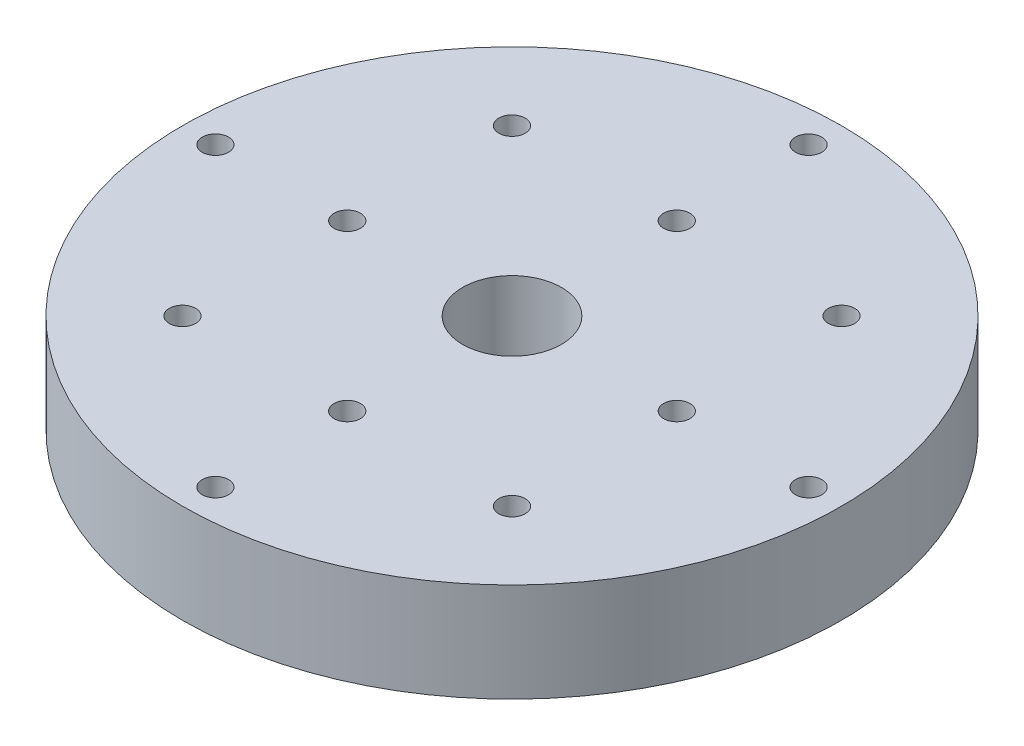
ISO-10303-21;
HEADER;
FILE_DESCRIPTION(('STEP AP214'),'2;1');
FILE_NAME('part.step','',(''),(''),'','','');
FILE_SCHEMA(('AUTOMOTIVE_DESIGN { 1 0 10303 214 1 1 1 1 }'));
ENDSEC;
DATA;
#1=APPLICATION_CONTEXT('core data for automotive mechanical design processes');
#2=APPLICATION_PROTOCOL_DEFINITION('international standard','automotive_design',2000,#1);
#3=PRODUCT_CONTEXT('',#1,'mechanical');
#4=PRODUCT('Part','Part','',(#3));
#5=PRODUCT_RELATED_PRODUCT_CATEGORY('part','',(#4));
#6=PRODUCT_DEFINITION_FORMATION('','',#4);
#7=PRODUCT_DEFINITION_CONTEXT('part definition',#1,'design');
#8=PRODUCT_DEFINITION('design','',#6,#7);
#9=PRODUCT_DEFINITION_SHAPE('','',#8);
#10=(LENGTH_UNIT() NAMED_UNIT(*) SI_UNIT(.MILLI.,.METRE.));
#11=(NAMED_UNIT(*) PLANE_ANGLE_UNIT() SI_UNIT($,.RADIAN.));
#12=(NAMED_UNIT(*) SI_UNIT($,.STERADIAN.) SOLID_ANGLE_UNIT());
#13=UNCERTAINTY_MEASURE_WITH_UNIT(LENGTH_MEASURE(1.E-05),#10,'distance_accuracy_value','');
#14=(GEOMETRIC_REPRESENTATION_CONTEXT(3) GLOBAL_UNCERTAINTY_ASSIGNED_CONTEXT((#13)) GLOBAL_UNIT_ASSIGNED_CONTEXT((#10,
#11,#12)) REPRESENTATION_CONTEXT('',''));
#15=CARTESIAN_POINT('',(0.,0.,0.));
#16=DIRECTION('',(0.,0.,1.));
#17=DIRECTION('',(1.,0.,0.));
#18=AXIS2_PLACEMENT_3D('',#15,#16,#17);
#19=CARTESIAN_POINT('',(0.,15.,0.));
#20=DIRECTION('',(0.,-1.,0.));
#21=DIRECTION('',(0.,0.,-1.));
#22=AXIS2_PLACEMENT_3D('',#19,#20,#21);
#23=CYLINDRICAL_SURFACE('',#22,50.);
#24=CARTESIAN_POINT('',(0.,15.,0.));
#25=DIRECTION('',(0.,1.,0.));
#26=DIRECTION('',(0.,0.,1.));
#27=AXIS2_PLACEMENT_3D('',#24,#25,#26);
#28=CIRCLE('',#27,50.);
#29=CARTESIAN_POINT('',(0.,15.,50.));
#30=VERTEX_POINT('',#29);
#31=EDGE_CURVE('E10',#30,#30,#28,.T.);
#32=ORIENTED_EDGE('',*,*,#31,.F.);
#33=EDGE_LOOP('',(#32));
#34=FACE_BOUND('',#33,.T.);
#35=CARTESIAN_POINT('',(0.,0.,0.));
#36=DIRECTION('',(0.,1.,0.));
#37=DIRECTION('',(0.,0.,1.));
#38=AXIS2_PLACEMENT_3D('',#35,#36,#37);
#39=CIRCLE('',#38,50.);
#40=CARTESIAN_POINT('',(0.,0.,50.));
#41=VERTEX_POINT('',#40);
#42=EDGE_CURVE('E50',#41,#41,#39,.T.);
#43=ORIENTED_EDGE('',*,*,#42,.T.);
#44=EDGE_LOOP('',(#43));
#45=FACE_BOUND('',#44,.T.);
#46=ADVANCED_FACE('F47',(#34,#45),#23,.T.);
#47=CARTESIAN_POINT('',(0.,15.,0.));
#48=DIRECTION('',(0.,1.,0.));
#49=DIRECTION('',(0.,0.,1.));
#50=AXIS2_PLACEMENT_3D('',#47,#48,#49);
#51=PLANE('',#50);
#52=CARTESIAN_POINT('',(25.,15.,25.));
#53=DIRECTION('',(0.,1.,0.));
#54=DIRECTION('',(0.,0.,1.));
#55=AXIS2_PLACEMENT_3D('',#52,#53,#54);
#56=CIRCLE('',#55,2.);
#57=CARTESIAN_POINT('',(25.,15.,27.));
#58=VERTEX_POINT('',#57);
#59=EDGE_CURVE('E122',#58,#58,#56,.T.);
#60=ORIENTED_EDGE('',*,*,#59,.F.);
#61=EDGE_LOOP('',(#60));
#62=FACE_BOUND('',#61,.T.);
#63=CARTESIAN_POINT('',(0.,15.,25.));
#64=DIRECTION('',(0.,1.,0.));
#65=DIRECTION('',(0.,0.,1.));
#66=AXIS2_PLACEMENT_3D('',#63,#64,#65);
#67=CIRCLE('',#66,2.);
#68=CARTESIAN_POINT('',(0.,15.,27.));
#69=VERTEX_POINT('',#68);
#70=EDGE_CURVE('E108',#69,#69,#67,.T.);
#71=ORIENTED_EDGE('',*,*,#70,.F.);
#72=EDGE_LOOP('',(#71));
#73=FACE_BOUND('',#72,.T.);
#74=CARTESIAN_POINT('',(0.,15.,45.));
#75=DIRECTION('',(0.,1.,0.));
#76=DIRECTION('',(0.,0.,1.));
#77=AXIS2_PLACEMENT_3D('',#74,#75,#76);
#78=CIRCLE('',#77,2.);
#79=CARTESIAN_POINT('',(0.,15.,47.));
#80=VERTEX_POINT('',#79);
#81=EDGE_CURVE('E107',#80,#80,#78,.T.);
#82=ORIENTED_EDGE('',*,*,#81,.F.);
#83=EDGE_LOOP('',(#82));
#84=FACE_BOUND('',#83,.T.);
#85=CARTESIAN_POINT('',(45.,15.,0.));
#86=DIRECTION('',(0.,1.,0.));
#87=DIRECTION('',(0.,0.,1.));
#88=AXIS2_PLACEMENT_3D('',#85,#86,#87);
#89=CIRCLE('',#88,2.);
#90=CARTESIAN_POINT('',(45.,15.,1.99999999999999));
#91=VERTEX_POINT('',#90);
#92=EDGE_CURVE('E65',#91,#91,#89,.T.);
#93=ORIENTED_EDGE('',*,*,#92,.F.);
#94=EDGE_LOOP('',(#93));
#95=FACE_BOUND('',#94,.T.);
#96=CARTESIAN_POINT('',(-25.,15.,-25.));
#97=DIRECTION('',(0.,1.,0.));
#98=DIRECTION('',(0.,0.,1.));
#99=AXIS2_PLACEMENT_3D('',#96,#97,#98);
#100=CIRCLE('',#99,2.);
#101=CARTESIAN_POINT('',(-25.,15.,-23.));
#102=VERTEX_POINT('',#101);
#103=EDGE_CURVE('E91',#102,#102,#100,.T.);
#104=ORIENTED_EDGE('',*,*,#103,.F.);
#105=EDGE_LOOP('',(#104));
#106=FACE_BOUND('',#105,.T.);
#107=CARTESIAN_POINT('',(-45.,15.,0.));
#108=DIRECTION('',(0.,1.,0.));
#109=DIRECTION('',(0.,0.,1.));
#110=AXIS2_PLACEMENT_3D('',#107,#108,#109);
#111=CIRCLE('',#110,2.);
#112=CARTESIAN_POINT('',(-45.,15.,2.));
#113=VERTEX_POINT('',#112);
#114=EDGE_CURVE('E74',#113,#113,#111,.T.);
#115=ORIENTED_EDGE('',*,*,#114,.F.);
#116=EDGE_LOOP('',(#115));
#117=FACE_BOUND('',#116,.T.);
#118=CARTESIAN_POINT('',(-25.,15.,0.));
#119=DIRECTION('',(0.,1.,0.));
#120=DIRECTION('',(0.,0.,1.));
#121=AXIS2_PLACEMENT_3D('',#118,#119,#120);
#122=CIRCLE('',#121,2.);
#123=CARTESIAN_POINT('',(-25.,15.,2.));
#124=VERTEX_POINT('',#123);
#125=EDGE_CURVE('E73',#124,#124,#122,.T.);
#126=ORIENTED_EDGE('',*,*,#125,.F.);
#127=EDGE_LOOP('',(#126));
#128=FACE_BOUND('',#127,.T.);
#129=CARTESIAN_POINT('',(-25.,15.,25.));
#130=DIRECTION('',(0.,1.,0.));
#131=DIRECTION('',(0.,0.,1.));
#132=AXIS2_PLACEMENT_3D('',#129,#130,#131);
#133=CIRCLE('',#132,2.);
#134=CARTESIAN_POINT('',(-25.,15.,27.));
#135=VERTEX_POINT('',#134);
#136=EDGE_CURVE('E82',#135,#135,#133,.T.);
#137=ORIENTED_EDGE('',*,*,#136,.F.);
#138=EDGE_LOOP('',(#137));
#139=FACE_BOUND('',#138,.T.);
#140=CARTESIAN_POINT('',(0.,15.,-45.));
#141=DIRECTION('',(0.,1.,0.));
#142=DIRECTION('',(0.,0.,1.));
#143=AXIS2_PLACEMENT_3D('',#140,#141,#142);
#144=CIRCLE('',#143,2.);
#145=CARTESIAN_POINT('',(0.,15.,-43.));
#146=VERTEX_POINT('',#145);
#147=EDGE_CURVE('E92',#146,#146,#144,.T.);
#148=ORIENTED_EDGE('',*,*,#147,.F.);
#149=EDGE_LOOP('',(#148));
#150=FACE_BOUND('',#149,.T.);
#151=CARTESIAN_POINT('',(0.,15.,-25.));
#152=DIRECTION('',(0.,1.,0.));
#153=DIRECTION('',(0.,0.,1.));
#154=AXIS2_PLACEMENT_3D('',#151,#152,#153);
#155=CIRCLE('',#154,2.);
#156=CARTESIAN_POINT('',(0.,15.,-23.));
#157=VERTEX_POINT('',#156);
#158=EDGE_CURVE('E153',#157,#157,#155,.T.);
#159=ORIENTED_EDGE('',*,*,#158,.F.);
#160=EDGE_LOOP('',(#159));
#161=FACE_BOUND('',#160,.T.);
#162=CARTESIAN_POINT('',(25.,15.,-25.));
#163=DIRECTION('',(0.,1.,0.));
#164=DIRECTION('',(0.,0.,1.));
#165=AXIS2_PLACEMENT_3D('',#162,#163,#164);
#166=CIRCLE('',#165,2.);
#167=CARTESIAN_POINT('',(25.,15.,-23.));
#168=VERTEX_POINT('',#167);
#169=EDGE_CURVE('E145',#168,#168,#166,.T.);
#170=ORIENTED_EDGE('',*,*,#169,.F.);
#171=EDGE_LOOP('',(#170));
#172=FACE_BOUND('',#171,.T.);
#173=CARTESIAN_POINT('',(25.,15.,0.));
#174=DIRECTION('',(0.,1.,0.));
#175=DIRECTION('',(0.,0.,1.));
#176=AXIS2_PLACEMENT_3D('',#173,#174,#175);
#177=CIRCLE('',#176,2.);
#178=CARTESIAN_POINT('',(25.,15.,2.));
#179=VERTEX_POINT('',#178);
#180=EDGE_CURVE('E137',#179,#179,#177,.T.);
#181=ORIENTED_EDGE('',*,*,#180,.F.);
#182=EDGE_LOOP('',(#181));
#183=FACE_BOUND('',#182,.T.);
#184=CARTESIAN_POINT('',(0.,15.,0.));
#185=DIRECTION('',(0.,1.,0.));
#186=DIRECTION('',(0.,0.,1.));
#187=AXIS2_PLACEMENT_3D('',#184,#185,#186);
#188=CIRCLE('',#187,7.5);
#189=CARTESIAN_POINT('',(0.,15.,7.5));
#190=VERTEX_POINT('',#189);
#191=EDGE_CURVE('E61',#190,#190,#188,.T.);
#192=ORIENTED_EDGE('',*,*,#191,.F.);
#193=EDGE_LOOP('',(#192));
#194=FACE_BOUND('',#193,.T.);
#195=ORIENTED_EDGE('',*,*,#31,.T.);
#196=EDGE_LOOP('',(#195));
#197=FACE_BOUND('',#196,.T.);
#198=ADVANCED_FACE('F167',(#62,#73,#84,#95,#106,#117,#128,#139,#150,#161,#172,#183,#194,#197),
#51,.T.);
#199=CARTESIAN_POINT('',(0.,0.,0.));
#200=DIRECTION('',(0.,1.,0.));
#201=DIRECTION('',(0.,0.,1.));
#202=AXIS2_PLACEMENT_3D('',#199,#200,#201);
#203=PLANE('',#202);
#204=CARTESIAN_POINT('',(25.,0.,25.));
#205=DIRECTION('',(0.,1.,0.));
#206=DIRECTION('',(0.,0.,1.));
#207=AXIS2_PLACEMENT_3D('',#204,#205,#206);
#208=CIRCLE('',#207,2.);
#209=CARTESIAN_POINT('',(25.,0.,27.));
#210=VERTEX_POINT('',#209);
#211=EDGE_CURVE('E86',#210,#210,#208,.T.);
#212=ORIENTED_EDGE('',*,*,#211,.T.);
#213=EDGE_LOOP('',(#212));
#214=FACE_BOUND('',#213,.T.);
#215=CARTESIAN_POINT('',(0.,0.,25.));
#216=DIRECTION('',(0.,1.,0.));
#217=DIRECTION('',(0.,0.,1.));
#218=AXIS2_PLACEMENT_3D('',#215,#216,#217);
#219=CIRCLE('',#218,2.);
#220=CARTESIAN_POINT('',(0.,0.,27.));
#221=VERTEX_POINT('',#220);
#222=EDGE_CURVE('E126',#221,#221,#219,.T.);
#223=ORIENTED_EDGE('',*,*,#222,.T.);
#224=EDGE_LOOP('',(#223));
#225=FACE_BOUND('',#224,.T.);
#226=CARTESIAN_POINT('',(0.,0.,45.));
#227=DIRECTION('',(0.,1.,0.));
#228=DIRECTION('',(0.,0.,1.));
#229=AXIS2_PLACEMENT_3D('',#226,#227,#228);
#230=CIRCLE('',#229,2.);
#231=CARTESIAN_POINT('',(0.,0.,47.));
#232=VERTEX_POINT('',#231);
#233=EDGE_CURVE('E103',#232,#232,#230,.T.);
#234=ORIENTED_EDGE('',*,*,#233,.T.);
#235=EDGE_LOOP('',(#234));
#236=FACE_BOUND('',#235,.T.);
#237=CARTESIAN_POINT('',(45.,0.,0.));
#238=DIRECTION('',(0.,1.,0.));
#239=DIRECTION('',(0.,0.,1.));
#240=AXIS2_PLACEMENT_3D('',#237,#238,#239);
#241=CIRCLE('',#240,2.);
#242=CARTESIAN_POINT('',(45.,0.,1.99999999999999));
#243=VERTEX_POINT('',#242);
#244=EDGE_CURVE('E112',#243,#243,#241,.T.);
#245=ORIENTED_EDGE('',*,*,#244,.T.);
#246=EDGE_LOOP('',(#245));
#247=FACE_BOUND('',#246,.T.);
#248=CARTESIAN_POINT('',(-25.,0.,-25.));
#249=DIRECTION('',(0.,1.,0.));
#250=DIRECTION('',(0.,0.,1.));
#251=AXIS2_PLACEMENT_3D('',#248,#249,#250);
#252=CIRCLE('',#251,2.);
#253=CARTESIAN_POINT('',(-25.,0.,-23.));
#254=VERTEX_POINT('',#253);
#255=EDGE_CURVE('E87',#254,#254,#252,.T.);
#256=ORIENTED_EDGE('',*,*,#255,.T.);
#257=EDGE_LOOP('',(#256));
#258=FACE_BOUND('',#257,.T.);
#259=CARTESIAN_POINT('',(-45.,0.,0.));
#260=DIRECTION('',(0.,1.,0.));
#261=DIRECTION('',(0.,0.,1.));
#262=AXIS2_PLACEMENT_3D('',#259,#260,#261);
#263=CIRCLE('',#262,2.);
#264=CARTESIAN_POINT('',(-45.,0.,2.));
#265=VERTEX_POINT('',#264);
#266=EDGE_CURVE('E96',#265,#265,#263,.T.);
#267=ORIENTED_EDGE('',*,*,#266,.T.);
#268=EDGE_LOOP('',(#267));
#269=FACE_BOUND('',#268,.T.);
#270=CARTESIAN_POINT('',(-25.,0.,0.));
#271=DIRECTION('',(0.,1.,0.));
#272=DIRECTION('',(0.,0.,1.));
#273=AXIS2_PLACEMENT_3D('',#270,#271,#272);
#274=CIRCLE('',#273,2.);
#275=CARTESIAN_POINT('',(-25.,0.,2.));
#276=VERTEX_POINT('',#275);
#277=EDGE_CURVE('E69',#276,#276,#274,.T.);
#278=ORIENTED_EDGE('',*,*,#277,.T.);
#279=EDGE_LOOP('',(#278));
#280=FACE_BOUND('',#279,.T.);
#281=CARTESIAN_POINT('',(-25.,0.,25.));
#282=DIRECTION('',(0.,1.,0.));
#283=DIRECTION('',(0.,0.,1.));
#284=AXIS2_PLACEMENT_3D('',#281,#282,#283);
#285=CIRCLE('',#284,2.);
#286=CARTESIAN_POINT('',(-25.,0.,27.));
#287=VERTEX_POINT('',#286);
#288=EDGE_CURVE('E78',#287,#287,#285,.T.);
#289=ORIENTED_EDGE('',*,*,#288,.T.);
#290=EDGE_LOOP('',(#289));
#291=FACE_BOUND('',#290,.T.);
#292=CARTESIAN_POINT('',(0.,0.,-45.));
#293=DIRECTION('',(0.,1.,0.));
#294=DIRECTION('',(0.,0.,1.));
#295=AXIS2_PLACEMENT_3D('',#292,#293,#294);
#296=CIRCLE('',#295,2.);
#297=CARTESIAN_POINT('',(0.,0.,-43.));
#298=VERTEX_POINT('',#297);
#299=EDGE_CURVE('E157',#298,#298,#296,.T.);
#300=ORIENTED_EDGE('',*,*,#299,.T.);
#301=EDGE_LOOP('',(#300));
#302=FACE_BOUND('',#301,.T.);
#303=CARTESIAN_POINT('',(0.,0.,-25.));
#304=DIRECTION('',(0.,1.,0.));
#305=DIRECTION('',(0.,0.,1.));
#306=AXIS2_PLACEMENT_3D('',#303,#304,#305);
#307=CIRCLE('',#306,2.);
#308=CARTESIAN_POINT('',(0.,0.,-23.));
#309=VERTEX_POINT('',#308);
#310=EDGE_CURVE('E149',#309,#309,#307,.T.);
#311=ORIENTED_EDGE('',*,*,#310,.T.);
#312=EDGE_LOOP('',(#311));
#313=FACE_BOUND('',#312,.T.);
#314=CARTESIAN_POINT('',(25.,0.,-25.));
#315=DIRECTION('',(0.,1.,0.));
#316=DIRECTION('',(0.,0.,1.));
#317=AXIS2_PLACEMENT_3D('',#314,#315,#316);
#318=CIRCLE('',#317,2.);
#319=CARTESIAN_POINT('',(25.,0.,-23.));
#320=VERTEX_POINT('',#319);
#321=EDGE_CURVE('E141',#320,#320,#318,.T.);
#322=ORIENTED_EDGE('',*,*,#321,.T.);
#323=EDGE_LOOP('',(#322));
#324=FACE_BOUND('',#323,.T.);
#325=CARTESIAN_POINT('',(25.,0.,0.));
#326=DIRECTION('',(0.,1.,0.));
#327=DIRECTION('',(0.,0.,1.));
#328=AXIS2_PLACEMENT_3D('',#325,#326,#327);
#329=CIRCLE('',#328,2.);
#330=CARTESIAN_POINT('',(25.,0.,2.));
#331=VERTEX_POINT('',#330);
#332=EDGE_CURVE('E133',#331,#331,#329,.T.);
#333=ORIENTED_EDGE('',*,*,#332,.T.);
#334=EDGE_LOOP('',(#333));
#335=FACE_BOUND('',#334,.T.);
#336=CARTESIAN_POINT('',(0.,0.,0.));
#337=DIRECTION('',(0.,1.,0.));
#338=DIRECTION('',(0.,0.,1.));
#339=AXIS2_PLACEMENT_3D('',#336,#337,#338);
#340=CIRCLE('',#339,7.5);
#341=CARTESIAN_POINT('',(0.,0.,7.5));
#342=VERTEX_POINT('',#341);
#343=EDGE_CURVE('E59',#342,#342,#340,.T.);
#344=ORIENTED_EDGE('',*,*,#343,.T.);
#345=EDGE_LOOP('',(#344));
#346=FACE_BOUND('',#345,.T.);
#347=ORIENTED_EDGE('',*,*,#42,.F.);
#348=EDGE_LOOP('',(#347));
#349=FACE_BOUND('',#348,.T.);
#350=ADVANCED_FACE('F170',(#214,#225,#236,#247,#258,#269,#280,#291,#302,#313,#324,#335,#346,
#349),#203,.F.);
#351=CARTESIAN_POINT('',(0.,0.,0.));
#352=DIRECTION('',(0.,1.,0.));
#353=DIRECTION('',(0.,0.,1.));
#354=AXIS2_PLACEMENT_3D('',#351,#352,#353);
#355=CYLINDRICAL_SURFACE('',#354,7.5);
#356=ORIENTED_EDGE('',*,*,#343,.F.);
#357=EDGE_LOOP('',(#356));
#358=FACE_BOUND('',#357,.T.);
#359=ORIENTED_EDGE('',*,*,#191,.T.);
#360=EDGE_LOOP('',(#359));
#361=FACE_BOUND('',#360,.T.);
#362=ADVANCED_FACE('F181',(#358,#361),#355,.F.);
#363=CARTESIAN_POINT('',(25.,0.,0.));
#364=DIRECTION('',(0.,1.,0.));
#365=DIRECTION('',(0.,0.,1.));
#366=AXIS2_PLACEMENT_3D('',#363,#364,#365);
#367=CYLINDRICAL_SURFACE('',#366,2.);
#368=ORIENTED_EDGE('',*,*,#332,.F.);
#369=EDGE_LOOP('',(#368));
#370=FACE_BOUND('',#369,.T.);
#371=ORIENTED_EDGE('',*,*,#180,.T.);
#372=EDGE_LOOP('',(#371));
#373=FACE_BOUND('',#372,.T.);
#374=ADVANCED_FACE('F183',(#370,#373),#367,.F.);
#375=CARTESIAN_POINT('',(25.,0.,-25.));
#376=DIRECTION('',(0.,1.,0.));
#377=DIRECTION('',(0.,0.,1.));
#378=AXIS2_PLACEMENT_3D('',#375,#376,#377);
#379=CYLINDRICAL_SURFACE('',#378,2.);
#380=ORIENTED_EDGE('',*,*,#321,.F.);
#381=EDGE_LOOP('',(#380));
#382=FACE_BOUND('',#381,.T.);
#383=ORIENTED_EDGE('',*,*,#169,.T.);
#384=EDGE_LOOP('',(#383));
#385=FACE_BOUND('',#384,.T.);
#386=ADVANCED_FACE('F190',(#382,#385),#379,.F.);
#387=CARTESIAN_POINT('',(0.,0.,-25.));
#388=DIRECTION('',(0.,1.,0.));
#389=DIRECTION('',(0.,0.,1.));
#390=AXIS2_PLACEMENT_3D('',#387,#388,#389);
#391=CYLINDRICAL_SURFACE('',#390,2.);
#392=ORIENTED_EDGE('',*,*,#310,.F.);
#393=EDGE_LOOP('',(#392));
#394=FACE_BOUND('',#393,.T.);
#395=ORIENTED_EDGE('',*,*,#158,.T.);
#396=EDGE_LOOP('',(#395));
#397=FACE_BOUND('',#396,.T.);
#398=ADVANCED_FACE('F230',(#394,#397),#391,.F.);
#399=CARTESIAN_POINT('',(0.,0.,-45.));
#400=DIRECTION('',(0.,1.,0.));
#401=DIRECTION('',(0.,0.,1.));
#402=AXIS2_PLACEMENT_3D('',#399,#400,#401);
#403=CYLINDRICAL_SURFACE('',#402,2.);
#404=ORIENTED_EDGE('',*,*,#299,.F.);
#405=EDGE_LOOP('',(#404));
#406=FACE_BOUND('',#405,.T.);
#407=ORIENTED_EDGE('',*,*,#147,.T.);
#408=EDGE_LOOP('',(#407));
#409=FACE_BOUND('',#408,.T.);
#410=ADVANCED_FACE('F165',(#406,#409),#403,.F.);
#411=CARTESIAN_POINT('',(-25.,0.,25.));
#412=DIRECTION('',(0.,1.,0.));
#413=DIRECTION('',(0.,0.,1.));
#414=AXIS2_PLACEMENT_3D('',#411,#412,#413);
#415=CYLINDRICAL_SURFACE('',#414,2.);
#416=ORIENTED_EDGE('',*,*,#288,.F.);
#417=EDGE_LOOP('',(#416));
#418=FACE_BOUND('',#417,.T.);
#419=ORIENTED_EDGE('',*,*,#136,.T.);
#420=EDGE_LOOP('',(#419));
#421=FACE_BOUND('',#420,.T.);
#422=ADVANCED_FACE('F249',(#418,#421),#415,.F.);
#423=CARTESIAN_POINT('',(-25.,0.,0.));
#424=DIRECTION('',(0.,1.,0.));
#425=DIRECTION('',(0.,0.,1.));
#426=AXIS2_PLACEMENT_3D('',#423,#424,#425);
#427=CYLINDRICAL_SURFACE('',#426,2.);
#428=ORIENTED_EDGE('',*,*,#277,.F.);
#429=EDGE_LOOP('',(#428));
#430=FACE_BOUND('',#429,.T.);
#431=ORIENTED_EDGE('',*,*,#125,.T.);
#432=EDGE_LOOP('',(#431));
#433=FACE_BOUND('',#432,.T.);
#434=ADVANCED_FACE('F259',(#430,#433),#427,.F.);
#435=CARTESIAN_POINT('',(-45.,0.,0.));
#436=DIRECTION('',(0.,1.,0.));
#437=DIRECTION('',(0.,0.,1.));
#438=AXIS2_PLACEMENT_3D('',#435,#436,#437);
#439=CYLINDRICAL_SURFACE('',#438,2.);
#440=ORIENTED_EDGE('',*,*,#266,.F.);
#441=EDGE_LOOP('',(#440));
#442=FACE_BOUND('',#441,.T.);
#443=ORIENTED_EDGE('',*,*,#114,.T.);
#444=EDGE_LOOP('',(#443));
#445=FACE_BOUND('',#444,.T.);
#446=ADVANCED_FACE('F269',(#442,#445),#439,.F.);
#447=CARTESIAN_POINT('',(-25.,0.,-25.));
#448=DIRECTION('',(0.,1.,0.));
#449=DIRECTION('',(0.,0.,1.));
#450=AXIS2_PLACEMENT_3D('',#447,#448,#449);
#451=CYLINDRICAL_SURFACE('',#450,2.);
#452=ORIENTED_EDGE('',*,*,#255,.F.);
#453=EDGE_LOOP('',(#452));
#454=FACE_BOUND('',#453,.T.);
#455=ORIENTED_EDGE('',*,*,#103,.T.);
#456=EDGE_LOOP('',(#455));
#457=FACE_BOUND('',#456,.T.);
#458=ADVANCED_FACE('F278',(#454,#457),#451,.F.);
#459=CARTESIAN_POINT('',(45.,0.,0.));
#460=DIRECTION('',(0.,1.,0.));
#461=DIRECTION('',(0.,0.,1.));
#462=AXIS2_PLACEMENT_3D('',#459,#460,#461);
#463=CYLINDRICAL_SURFACE('',#462,2.);
#464=ORIENTED_EDGE('',*,*,#244,.F.);
#465=EDGE_LOOP('',(#464));
#466=FACE_BOUND('',#465,.T.);
#467=ORIENTED_EDGE('',*,*,#92,.T.);
#468=EDGE_LOOP('',(#467));
#469=FACE_BOUND('',#468,.T.);
#470=ADVANCED_FACE('F288',(#466,#469),#463,.F.);
#471=CARTESIAN_POINT('',(0.,0.,45.));
#472=DIRECTION('',(0.,1.,0.));
#473=DIRECTION('',(0.,0.,1.));
#474=AXIS2_PLACEMENT_3D('',#471,#472,#473);
#475=CYLINDRICAL_SURFACE('',#474,2.);
#476=ORIENTED_EDGE('',*,*,#233,.F.);
#477=EDGE_LOOP('',(#476));
#478=FACE_BOUND('',#477,.T.);
#479=ORIENTED_EDGE('',*,*,#81,.T.);
#480=EDGE_LOOP('',(#479));
#481=FACE_BOUND('',#480,.T.);
#482=ADVANCED_FACE('F298',(#478,#481),#475,.F.);
#483=CARTESIAN_POINT('',(0.,0.,25.));
#484=DIRECTION('',(0.,1.,0.));
#485=DIRECTION('',(0.,0.,1.));
#486=AXIS2_PLACEMENT_3D('',#483,#484,#485);
#487=CYLINDRICAL_SURFACE('',#486,2.);
#488=ORIENTED_EDGE('',*,*,#222,.F.);
#489=EDGE_LOOP('',(#488));
#490=FACE_BOUND('',#489,.T.);
#491=ORIENTED_EDGE('',*,*,#70,.T.);
#492=EDGE_LOOP('',(#491));
#493=FACE_BOUND('',#492,.T.);
#494=ADVANCED_FACE('F308',(#490,#493),#487,.F.);
#495=CARTESIAN_POINT('',(25.,0.,25.));
#496=DIRECTION('',(0.,1.,0.));
#497=DIRECTION('',(0.,0.,1.));
#498=AXIS2_PLACEMENT_3D('',#495,#496,#497);
#499=CYLINDRICAL_SURFACE('',#498,2.);
#500=ORIENTED_EDGE('',*,*,#211,.F.);
#501=EDGE_LOOP('',(#500));
#502=FACE_BOUND('',#501,.T.);
#503=ORIENTED_EDGE('',*,*,#59,.T.);
#504=EDGE_LOOP('',(#503));
#505=FACE_BOUND('',#504,.T.);
#506=ADVANCED_FACE('F318',(#502,#505),#499,.F.);
#507=CLOSED_SHELL('',(#46,#198,#350,#362,#374,#386,#398,#410,#422,#434,#446,#458,#470,#482,#494,#506));
#508=MANIFOLD_SOLID_BREP('B2',#507);
#509=ADVANCED_BREP_SHAPE_REPRESENTATION('',(#18,#508),#14);
#510=SHAPE_DEFINITION_REPRESENTATION(#9,#509);
ENDSEC;
END-ISO-10303-21;
